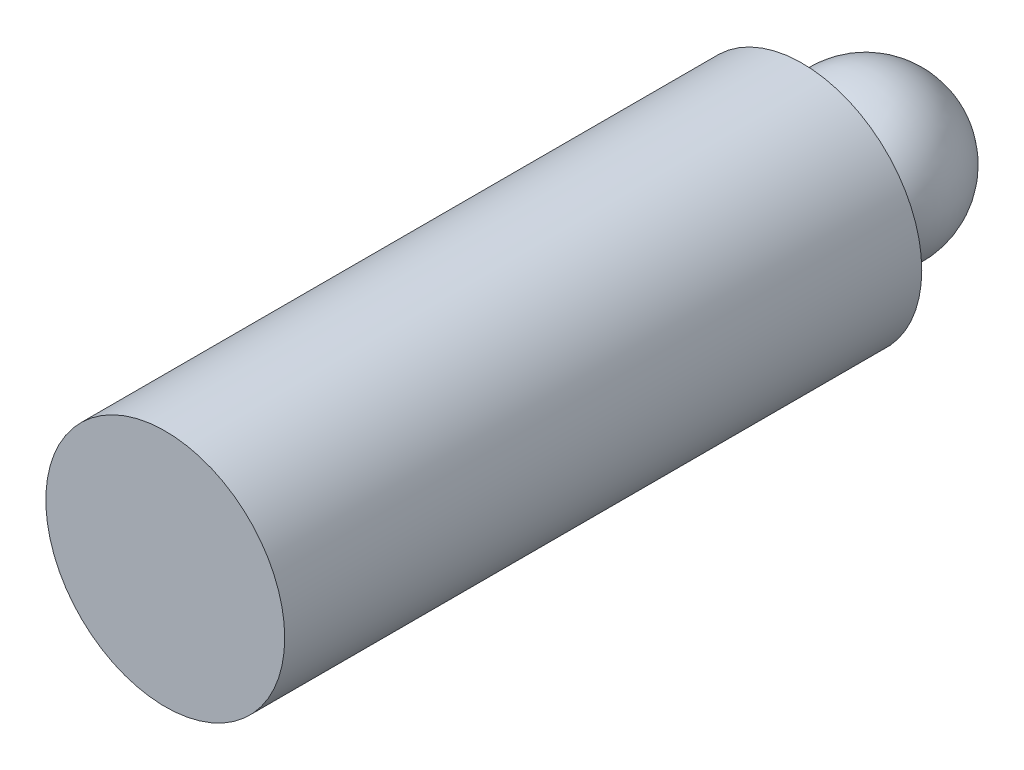
ISO-10303-21;
HEADER;
FILE_DESCRIPTION(('STEP AP214'),'2;1');
FILE_NAME('part.step','',(''),(''),'','','');
FILE_SCHEMA(('AUTOMOTIVE_DESIGN { 1 0 10303 214 1 1 1 1 }'));
ENDSEC;
DATA;
#1=APPLICATION_CONTEXT('core data for automotive mechanical design processes');
#2=APPLICATION_PROTOCOL_DEFINITION('international standard','automotive_design',2000,#1);
#3=PRODUCT_CONTEXT('',#1,'mechanical');
#4=PRODUCT('Part','Part','',(#3));
#5=PRODUCT_RELATED_PRODUCT_CATEGORY('part','',(#4));
#6=PRODUCT_DEFINITION_FORMATION('','',#4);
#7=PRODUCT_DEFINITION_CONTEXT('part definition',#1,'design');
#8=PRODUCT_DEFINITION('design','',#6,#7);
#9=PRODUCT_DEFINITION_SHAPE('','',#8);
#10=(LENGTH_UNIT() NAMED_UNIT(*) SI_UNIT(.MILLI.,.METRE.));
#11=(NAMED_UNIT(*) PLANE_ANGLE_UNIT() SI_UNIT($,.RADIAN.));
#12=(NAMED_UNIT(*) SI_UNIT($,.STERADIAN.) SOLID_ANGLE_UNIT());
#13=UNCERTAINTY_MEASURE_WITH_UNIT(LENGTH_MEASURE(1.E-05),#10,'distance_accuracy_value','');
#14=(GEOMETRIC_REPRESENTATION_CONTEXT(3) GLOBAL_UNCERTAINTY_ASSIGNED_CONTEXT((#13)) GLOBAL_UNIT_ASSIGNED_CONTEXT((#10,
#11,#12)) REPRESENTATION_CONTEXT('',''));
#15=CARTESIAN_POINT('',(0.,0.,0.));
#16=DIRECTION('',(0.,0.,1.));
#17=DIRECTION('',(1.,0.,0.));
#18=AXIS2_PLACEMENT_3D('',#15,#16,#17);
#19=CARTESIAN_POINT('',(0.,0.,-7.94153756602947));
#20=DIRECTION('',(0.,0.,-1.));
#21=DIRECTION('',(1.,0.,0.));
#22=AXIS2_PLACEMENT_3D('',#19,#20,#21);
#23=SPHERICAL_SURFACE('',#22,10.);
#24=CARTESIAN_POINT('',(0.,0.,-17.9415375660295));
#25=VERTEX_POINT('',#24);
#26=VERTEX_LOOP('',#25);
#27=FACE_BOUND('',#26,.T.);
#28=ADVANCED_FACE('F49',(#27),#23,.T.);
#29=CLOSED_SHELL('',(#28));
#30=MANIFOLD_SOLID_BREP('B2',#29);
#31=CARTESIAN_POINT('',(0.,0.,80.));
#32=DIRECTION('',(0.,0.,-1.));
#33=DIRECTION('',(-1.,0.,0.));
#34=AXIS2_PLACEMENT_3D('',#31,#32,#33);
#35=CYLINDRICAL_SURFACE('',#34,15.);
#36=CARTESIAN_POINT('',(0.,0.,80.));
#37=DIRECTION('',(0.,0.,1.));
#38=DIRECTION('',(1.,0.,0.));
#39=AXIS2_PLACEMENT_3D('',#36,#37,#38);
#40=CIRCLE('',#39,15.);
#41=CARTESIAN_POINT('',(15.,0.,80.));
#42=VERTEX_POINT('',#41);
#43=EDGE_CURVE('E48',#42,#42,#40,.T.);
#44=ORIENTED_EDGE('',*,*,#43,.F.);
#45=EDGE_LOOP('',(#44));
#46=FACE_BOUND('',#45,.T.);
#47=CARTESIAN_POINT('',(0.,0.,0.));
#48=DIRECTION('',(0.,0.,1.));
#49=DIRECTION('',(1.,0.,0.));
#50=AXIS2_PLACEMENT_3D('',#47,#48,#49);
#51=CIRCLE('',#50,15.);
#52=CARTESIAN_POINT('',(15.,0.,0.));
#53=VERTEX_POINT('',#52);
#54=EDGE_CURVE('E65',#53,#53,#51,.T.);
#55=ORIENTED_EDGE('',*,*,#54,.T.);
#56=EDGE_LOOP('',(#55));
#57=FACE_BOUND('',#56,.T.);
#58=ADVANCED_FACE('F62',(#46,#57),#35,.T.);
#59=CARTESIAN_POINT('',(0.,0.,80.));
#60=DIRECTION('',(0.,0.,1.));
#61=DIRECTION('',(1.,0.,0.));
#62=AXIS2_PLACEMENT_3D('',#59,#60,#61);
#63=PLANE('',#62);
#64=ORIENTED_EDGE('',*,*,#43,.T.);
#65=EDGE_LOOP('',(#64));
#66=FACE_BOUND('',#65,.T.);
#67=ADVANCED_FACE('F79',(#66),#63,.T.);
#68=CARTESIAN_POINT('',(0.,0.,0.));
#69=DIRECTION('',(0.,0.,1.));
#70=DIRECTION('',(1.,0.,0.));
#71=AXIS2_PLACEMENT_3D('',#68,#69,#70);
#72=PLANE('',#71);
#73=ORIENTED_EDGE('',*,*,#54,.F.);
#74=EDGE_LOOP('',(#73));
#75=FACE_BOUND('',#74,.T.);
#76=ADVANCED_FACE('F77',(#75),#72,.F.);
#77=CLOSED_SHELL('',(#58,#67,#76));
#78=MANIFOLD_SOLID_BREP('B6',#77);
#79=ADVANCED_BREP_SHAPE_REPRESENTATION('',(#18,#30,#78),#14);
#80=SHAPE_DEFINITION_REPRESENTATION(#9,#79);
ENDSEC;
END-ISO-10303-21;
